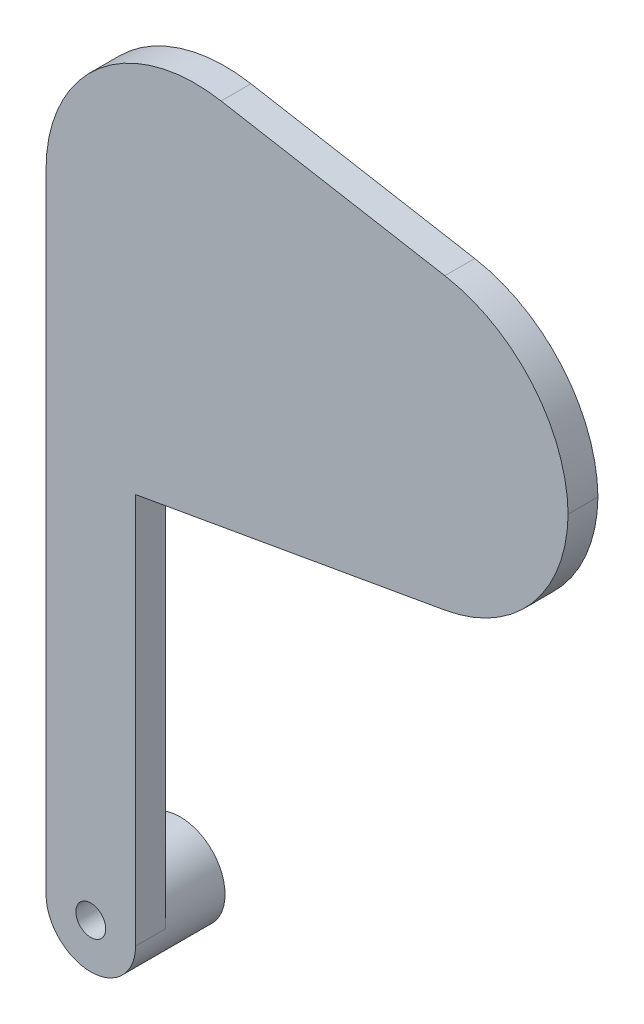
ISO-10303-21;
HEADER;
FILE_DESCRIPTION(('STEP AP214'),'2;1');
FILE_NAME('part.step','',(''),(''),'','','');
FILE_SCHEMA(('AUTOMOTIVE_DESIGN { 1 0 10303 214 1 1 1 1 }'));
ENDSEC;
DATA;
#1=APPLICATION_CONTEXT('core data for automotive mechanical design processes');
#2=APPLICATION_PROTOCOL_DEFINITION('international standard','automotive_design',2000,#1);
#3=PRODUCT_CONTEXT('',#1,'mechanical');
#4=PRODUCT('Part','Part','',(#3));
#5=PRODUCT_RELATED_PRODUCT_CATEGORY('part','',(#4));
#6=PRODUCT_DEFINITION_FORMATION('','',#4);
#7=PRODUCT_DEFINITION_CONTEXT('part definition',#1,'design');
#8=PRODUCT_DEFINITION('design','',#6,#7);
#9=PRODUCT_DEFINITION_SHAPE('','',#8);
#10=(LENGTH_UNIT() NAMED_UNIT(*) SI_UNIT(.MILLI.,.METRE.));
#11=(NAMED_UNIT(*) PLANE_ANGLE_UNIT() SI_UNIT($,.RADIAN.));
#12=(NAMED_UNIT(*) SI_UNIT($,.STERADIAN.) SOLID_ANGLE_UNIT());
#13=UNCERTAINTY_MEASURE_WITH_UNIT(LENGTH_MEASURE(1.E-05),#10,'distance_accuracy_value','');
#14=(GEOMETRIC_REPRESENTATION_CONTEXT(3) GLOBAL_UNCERTAINTY_ASSIGNED_CONTEXT((#13)) GLOBAL_UNIT_ASSIGNED_CONTEXT((#10,
#11,#12)) REPRESENTATION_CONTEXT('',''));
#15=CARTESIAN_POINT('',(0.,0.,0.));
#16=DIRECTION('',(0.,0.,1.));
#17=DIRECTION('',(1.,0.,0.));
#18=AXIS2_PLACEMENT_3D('',#15,#16,#17);
#19=CARTESIAN_POINT('',(25.,39.4375593634308,2.));
#20=DIRECTION('',(0.,0.,-1.));
#21=DIRECTION('',(-1.,0.,0.));
#22=AXIS2_PLACEMENT_3D('',#19,#20,#21);
#23=CYLINDRICAL_SURFACE('',#22,10.);
#24=CARTESIAN_POINT('',(25.,39.4375593634308,0.));
#25=DIRECTION('',(0.,0.,1.));
#26=DIRECTION('',(1.,0.,0.));
#27=AXIS2_PLACEMENT_3D('',#24,#25,#26);
#28=CIRCLE('',#27,10.);
#29=CARTESIAN_POINT('',(26.7364817766693,49.2856368935529,0.));
#30=VERTEX_POINT('',#29);
#31=CARTESIAN_POINT('',(34.999006976508,39.5784830439962,0.));
#32=VERTEX_POINT('',#31);
#33=EDGE_CURVE('E140',#30,#32,#28,.F.);
#34=ORIENTED_EDGE('',*,*,#33,.F.);
#35=DIRECTION('',(0.,0.,-1.));
#36=VECTOR('',#35,1.);
#37=CARTESIAN_POINT('',(26.7364817766693,49.2856368935529,2.));
#38=LINE('',#37,#36);
#39=CARTESIAN_POINT('',(26.7364817766693,49.2856368935529,2.));
#40=VERTEX_POINT('',#39);
#41=EDGE_CURVE('E50',#40,#30,#38,.T.);
#42=ORIENTED_EDGE('',*,*,#41,.F.);
#43=CARTESIAN_POINT('',(25.,39.4375593634308,2.));
#44=DIRECTION('',(0.,0.,1.));
#45=DIRECTION('',(1.,0.,0.));
#46=AXIS2_PLACEMENT_3D('',#43,#44,#45);
#47=CIRCLE('',#46,10.);
#48=CARTESIAN_POINT('',(34.999006976508,39.5784830439962,2.));
#49=VERTEX_POINT('',#48);
#50=EDGE_CURVE('E165',#40,#49,#47,.F.);
#51=ORIENTED_EDGE('',*,*,#50,.T.);
#52=DIRECTION('',(0.,0.,-1.));
#53=VECTOR('',#52,1.);
#54=CARTESIAN_POINT('',(34.999006976508,39.5784830439962,2.));
#55=LINE('',#54,#53);
#56=EDGE_CURVE('E58',#49,#32,#55,.T.);
#57=ORIENTED_EDGE('',*,*,#56,.T.);
#58=EDGE_LOOP('',(#34,#42,#51,#57));
#59=FACE_BOUND('',#58,.T.);
#60=ADVANCED_FACE('F41',(#59),#23,.T.);
#61=CARTESIAN_POINT('',(9.23454386979323,52.3717007612195,2.));
#62=DIRECTION('',(0.173648177666934,0.984807753012207,0.));
#63=DIRECTION('',(-0.984807753012208,0.173648177666934,0.));
#64=AXIS2_PLACEMENT_3D('',#61,#62,#63);
#65=PLANE('',#64);
#66=DIRECTION('',(0.984807753012208,-0.173648177666934,0.));
#67=VECTOR('',#66,1.);
#68=CARTESIAN_POINT('',(9.23454386979323,52.3717007612195,0.));
#69=LINE('',#68,#67);
#70=CARTESIAN_POINT('',(11.7364817766694,51.9305416041799,0.));
#71=VERTEX_POINT('',#70);
#72=EDGE_CURVE('E143',#71,#30,#69,.T.);
#73=ORIENTED_EDGE('',*,*,#72,.F.);
#74=DIRECTION('',(0.,0.,-1.));
#75=VECTOR('',#74,1.);
#76=CARTESIAN_POINT('',(11.7364817766694,51.9305416041799,2.));
#77=LINE('',#76,#75);
#78=CARTESIAN_POINT('',(11.7364817766694,51.9305416041799,2.));
#79=VERTEX_POINT('',#78);
#80=EDGE_CURVE('E179',#79,#71,#77,.T.);
#81=ORIENTED_EDGE('',*,*,#80,.F.);
#82=DIRECTION('',(0.984807753012208,-0.173648177666934,0.));
#83=VECTOR('',#82,1.);
#84=CARTESIAN_POINT('',(9.23454386979323,52.3717007612195,2.));
#85=LINE('',#84,#83);
#86=EDGE_CURVE('E187',#79,#40,#85,.T.);
#87=ORIENTED_EDGE('',*,*,#86,.T.);
#88=ORIENTED_EDGE('',*,*,#41,.T.);
#89=EDGE_LOOP('',(#73,#81,#87,#88));
#90=FACE_BOUND('',#89,.T.);
#91=ADVANCED_FACE('F185',(#90),#65,.T.);
#92=CARTESIAN_POINT('',(10.,42.0824640740579,2.));
#93=DIRECTION('',(0.,0.,-1.));
#94=DIRECTION('',(-1.,0.,0.));
#95=AXIS2_PLACEMENT_3D('',#92,#93,#94);
#96=CYLINDRICAL_SURFACE('',#95,10.);
#97=CARTESIAN_POINT('',(10.,42.0824640740579,0.));
#98=DIRECTION('',(0.,0.,1.));
#99=DIRECTION('',(1.,0.,0.));
#100=AXIS2_PLACEMENT_3D('',#97,#98,#99);
#101=CIRCLE('',#100,10.);
#102=CARTESIAN_POINT('',(0.,42.0824640740578,0.));
#103=VERTEX_POINT('',#102);
#104=EDGE_CURVE('E148',#103,#71,#101,.F.);
#105=ORIENTED_EDGE('',*,*,#104,.F.);
#106=DIRECTION('',(0.,0.,-1.));
#107=VECTOR('',#106,1.);
#108=CARTESIAN_POINT('',(0.,42.0824640740578,2.));
#109=LINE('',#108,#107);
#110=CARTESIAN_POINT('',(0.,42.0824640740578,2.));
#111=VERTEX_POINT('',#110);
#112=EDGE_CURVE('E176',#111,#103,#109,.T.);
#113=ORIENTED_EDGE('',*,*,#112,.F.);
#114=CARTESIAN_POINT('',(10.,42.0824640740579,2.));
#115=DIRECTION('',(0.,0.,1.));
#116=DIRECTION('',(1.,0.,0.));
#117=AXIS2_PLACEMENT_3D('',#114,#115,#116);
#118=CIRCLE('',#117,10.);
#119=EDGE_CURVE('E196',#111,#79,#118,.F.);
#120=ORIENTED_EDGE('',*,*,#119,.T.);
#121=ORIENTED_EDGE('',*,*,#80,.T.);
#122=EDGE_LOOP('',(#105,#113,#120,#121));
#123=FACE_BOUND('',#122,.T.);
#124=ADVANCED_FACE('F193',(#123),#96,.T.);
#125=CARTESIAN_POINT('',(0.,0.,2.));
#126=DIRECTION('',(-1.,0.,0.));
#127=DIRECTION('',(0.,0.,1.));
#128=AXIS2_PLACEMENT_3D('',#125,#126,#127);
#129=PLANE('',#128);
#130=DIRECTION('',(0.,1.,0.));
#131=VECTOR('',#130,1.);
#132=CARTESIAN_POINT('',(0.,0.,0.));
#133=LINE('',#132,#131);
#134=CARTESIAN_POINT('',(0.,0.,0.));
#135=VERTEX_POINT('',#134);
#136=EDGE_CURVE('E152',#135,#103,#133,.T.);
#137=ORIENTED_EDGE('',*,*,#136,.F.);
#138=DIRECTION('',(0.,0.,-1.));
#139=VECTOR('',#138,1.);
#140=CARTESIAN_POINT('',(0.,0.,2.));
#141=LINE('',#140,#139);
#142=CARTESIAN_POINT('',(0.,0.,2.));
#143=VERTEX_POINT('',#142);
#144=EDGE_CURVE('E172',#143,#135,#141,.T.);
#145=ORIENTED_EDGE('',*,*,#144,.F.);
#146=DIRECTION('',(0.,1.,0.));
#147=VECTOR('',#146,1.);
#148=CARTESIAN_POINT('',(0.,0.,2.));
#149=LINE('',#148,#147);
#150=EDGE_CURVE('E202',#143,#111,#149,.T.);
#151=ORIENTED_EDGE('',*,*,#150,.T.);
#152=ORIENTED_EDGE('',*,*,#112,.T.);
#153=EDGE_LOOP('',(#137,#145,#151,#152));
#154=FACE_BOUND('',#153,.T.);
#155=ADVANCED_FACE('F210',(#154),#129,.T.);
#156=CARTESIAN_POINT('',(3.,0.,2.));
#157=DIRECTION('',(0.,0.,-1.));
#158=DIRECTION('',(-1.,0.,0.));
#159=AXIS2_PLACEMENT_3D('',#156,#157,#158);
#160=CYLINDRICAL_SURFACE('',#159,3.);
#161=ORIENTED_EDGE('',*,*,#144,.T.);
#162=CARTESIAN_POINT('',(3.,0.,0.));
#163=DIRECTION('',(0.,0.,1.));
#164=DIRECTION('',(1.,0.,0.));
#165=AXIS2_PLACEMENT_3D('',#162,#163,#164);
#166=CIRCLE('',#165,3.);
#167=CARTESIAN_POINT('',(6.,0.,0.));
#168=VERTEX_POINT('',#167);
#169=EDGE_CURVE('E11',#168,#135,#166,.T.);
#170=ORIENTED_EDGE('',*,*,#169,.F.);
#171=DIRECTION('',(0.,0.,-1.));
#172=VECTOR('',#171,1.);
#173=CARTESIAN_POINT('',(6.,0.,2.));
#174=LINE('',#173,#172);
#175=CARTESIAN_POINT('',(6.,0.,2.));
#176=VERTEX_POINT('',#175);
#177=EDGE_CURVE('E119',#176,#168,#174,.T.);
#178=ORIENTED_EDGE('',*,*,#177,.F.);
#179=CARTESIAN_POINT('',(3.,0.,2.));
#180=DIRECTION('',(0.,0.,1.));
#181=DIRECTION('',(1.,0.,0.));
#182=AXIS2_PLACEMENT_3D('',#179,#180,#181);
#183=CIRCLE('',#182,3.);
#184=EDGE_CURVE('E128',#143,#176,#183,.T.);
#185=ORIENTED_EDGE('',*,*,#184,.F.);
#186=EDGE_LOOP('',(#161,#170,#178,#185));
#187=FACE_BOUND('',#186,.T.);
#188=CARTESIAN_POINT('',(3.,0.,-4.));
#189=DIRECTION('',(0.,0.,1.));
#190=DIRECTION('',(1.,0.,0.));
#191=AXIS2_PLACEMENT_3D('',#188,#189,#190);
#192=CIRCLE('',#191,3.);
#193=CARTESIAN_POINT('',(6.,0.,-4.));
#194=VERTEX_POINT('',#193);
#195=EDGE_CURVE('E144',#194,#194,#192,.T.);
#196=ORIENTED_EDGE('',*,*,#195,.T.);
#197=EDGE_LOOP('',(#196));
#198=FACE_BOUND('',#197,.T.);
#199=ADVANCED_FACE('F212',(#187,#198),#160,.T.);
#200=CARTESIAN_POINT('',(6.,0.,2.));
#201=DIRECTION('',(1.,0.,0.));
#202=DIRECTION('',(0.,1.,0.));
#203=AXIS2_PLACEMENT_3D('',#200,#201,#202);
#204=PLANE('',#203);
#205=DIRECTION('',(0.,-1.,0.));
#206=VECTOR('',#205,1.);
#207=CARTESIAN_POINT('',(6.,0.,0.));
#208=LINE('',#207,#206);
#209=CARTESIAN_POINT('',(6.,26.214927972243,0.));
#210=VERTEX_POINT('',#209);
#211=EDGE_CURVE('E114',#210,#168,#208,.T.);
#212=ORIENTED_EDGE('',*,*,#211,.F.);
#213=DIRECTION('',(0.,0.,-1.));
#214=VECTOR('',#213,1.);
#215=CARTESIAN_POINT('',(6.,26.214927972243,2.));
#216=LINE('',#215,#214);
#217=CARTESIAN_POINT('',(6.,26.214927972243,2.));
#218=VERTEX_POINT('',#217);
#219=EDGE_CURVE('E108',#218,#210,#216,.T.);
#220=ORIENTED_EDGE('',*,*,#219,.F.);
#221=DIRECTION('',(0.,-1.,0.));
#222=VECTOR('',#221,1.);
#223=CARTESIAN_POINT('',(6.,0.,2.));
#224=LINE('',#223,#222);
#225=EDGE_CURVE('E112',#218,#176,#224,.T.);
#226=ORIENTED_EDGE('',*,*,#225,.T.);
#227=ORIENTED_EDGE('',*,*,#177,.T.);
#228=EDGE_LOOP('',(#212,#220,#226,#227));
#229=FACE_BOUND('',#228,.T.);
#230=ADVANCED_FACE('F110',(#229),#204,.T.);
#231=CARTESIAN_POINT('',(-4.3020945735268,24.3983907411201,2.));
#232=DIRECTION('',(0.17364817766692,-0.98480775301221,0.));
#233=DIRECTION('',(0.98480775301221,0.17364817766692,0.));
#234=AXIS2_PLACEMENT_3D('',#231,#232,#233);
#235=PLANE('',#234);
#236=DIRECTION('',(-0.98480775301221,-0.17364817766692,0.));
#237=VECTOR('',#236,1.);
#238=CARTESIAN_POINT('',(-4.3020945735268,24.3983907411201,0.));
#239=LINE('',#238,#237);
#240=CARTESIAN_POINT('',(26.7364817766692,29.8713291944389,0.));
#241=VERTEX_POINT('',#240);
#242=EDGE_CURVE('E158',#241,#210,#239,.T.);
#243=ORIENTED_EDGE('',*,*,#242,.F.);
#244=DIRECTION('',(0.,0.,-1.));
#245=VECTOR('',#244,1.);
#246=CARTESIAN_POINT('',(26.7364817766692,29.8713291944389,2.));
#247=LINE('',#246,#245);
#248=CARTESIAN_POINT('',(26.7364817766692,29.8713291944389,2.));
#249=VERTEX_POINT('',#248);
#250=EDGE_CURVE('E82',#249,#241,#247,.T.);
#251=ORIENTED_EDGE('',*,*,#250,.F.);
#252=DIRECTION('',(-0.98480775301221,-0.17364817766692,0.));
#253=VECTOR('',#252,1.);
#254=CARTESIAN_POINT('',(-4.3020945735268,24.3983907411201,2.));
#255=LINE('',#254,#253);
#256=EDGE_CURVE('E126',#249,#218,#255,.T.);
#257=ORIENTED_EDGE('',*,*,#256,.T.);
#258=ORIENTED_EDGE('',*,*,#219,.T.);
#259=EDGE_LOOP('',(#243,#251,#257,#258));
#260=FACE_BOUND('',#259,.T.);
#261=ADVANCED_FACE('F132',(#260),#235,.T.);
#262=CARTESIAN_POINT('',(25.,39.719406724561,2.));
#263=DIRECTION('',(0.,0.,-1.));
#264=DIRECTION('',(-1.,0.,0.));
#265=AXIS2_PLACEMENT_3D('',#262,#263,#264);
#266=CYLINDRICAL_SURFACE('',#265,10.);
#267=CARTESIAN_POINT('',(25.,39.719406724561,0.));
#268=DIRECTION('',(0.,0.,1.));
#269=DIRECTION('',(1.,0.,0.));
#270=AXIS2_PLACEMENT_3D('',#267,#268,#269);
#271=CIRCLE('',#270,10.);
#272=EDGE_CURVE('E161',#32,#241,#271,.F.);
#273=ORIENTED_EDGE('',*,*,#272,.F.);
#274=ORIENTED_EDGE('',*,*,#56,.F.);
#275=CARTESIAN_POINT('',(25.,39.719406724561,2.));
#276=DIRECTION('',(0.,0.,1.));
#277=DIRECTION('',(1.,0.,0.));
#278=AXIS2_PLACEMENT_3D('',#275,#276,#277);
#279=CIRCLE('',#278,10.);
#280=EDGE_CURVE('E134',#49,#249,#279,.F.);
#281=ORIENTED_EDGE('',*,*,#280,.T.);
#282=ORIENTED_EDGE('',*,*,#250,.T.);
#283=EDGE_LOOP('',(#273,#274,#281,#282));
#284=FACE_BOUND('',#283,.T.);
#285=ADVANCED_FACE('F214',(#284),#266,.T.);
#286=CARTESIAN_POINT('',(0.,0.,2.));
#287=DIRECTION('',(0.,0.,1.));
#288=DIRECTION('',(1.,0.,0.));
#289=AXIS2_PLACEMENT_3D('',#286,#287,#288);
#290=PLANE('',#289);
#291=CARTESIAN_POINT('',(3.,0.,2.));
#292=DIRECTION('',(0.,0.,-1.));
#293=DIRECTION('',(-1.,0.,0.));
#294=AXIS2_PLACEMENT_3D('',#291,#292,#293);
#295=CIRCLE('',#294,1.);
#296=CARTESIAN_POINT('',(2.,0.,2.));
#297=VERTEX_POINT('',#296);
#298=EDGE_CURVE('E327',#297,#297,#295,.T.);
#299=ORIENTED_EDGE('',*,*,#298,.T.);
#300=EDGE_LOOP('',(#299));
#301=FACE_BOUND('',#300,.T.);
#302=ORIENTED_EDGE('',*,*,#150,.F.);
#303=ORIENTED_EDGE('',*,*,#184,.T.);
#304=ORIENTED_EDGE('',*,*,#225,.F.);
#305=ORIENTED_EDGE('',*,*,#256,.F.);
#306=ORIENTED_EDGE('',*,*,#280,.F.);
#307=ORIENTED_EDGE('',*,*,#50,.F.);
#308=ORIENTED_EDGE('',*,*,#86,.F.);
#309=ORIENTED_EDGE('',*,*,#119,.F.);
#310=EDGE_LOOP('',(#302,#303,#304,#305,#306,#307,#308,#309));
#311=FACE_BOUND('',#310,.T.);
#312=ADVANCED_FACE('F124',(#301,#311),#290,.T.);
#313=CARTESIAN_POINT('',(0.,0.,0.));
#314=DIRECTION('',(0.,0.,1.));
#315=DIRECTION('',(1.,0.,0.));
#316=AXIS2_PLACEMENT_3D('',#313,#314,#315);
#317=PLANE('',#316);
#318=ORIENTED_EDGE('',*,*,#211,.T.);
#319=ORIENTED_EDGE('',*,*,#169,.T.);
#320=ORIENTED_EDGE('',*,*,#136,.T.);
#321=ORIENTED_EDGE('',*,*,#104,.T.);
#322=ORIENTED_EDGE('',*,*,#72,.T.);
#323=ORIENTED_EDGE('',*,*,#33,.T.);
#324=ORIENTED_EDGE('',*,*,#272,.T.);
#325=ORIENTED_EDGE('',*,*,#242,.T.);
#326=EDGE_LOOP('',(#318,#319,#320,#321,#322,#323,#324,#325));
#327=FACE_BOUND('',#326,.T.);
#328=ADVANCED_FACE('F189',(#327),#317,.F.);
#329=CARTESIAN_POINT('',(3.,0.,-4.));
#330=DIRECTION('',(0.,0.,1.));
#331=DIRECTION('',(1.,0.,0.));
#332=AXIS2_PLACEMENT_3D('',#329,#330,#331);
#333=PLANE('',#332);
#334=CARTESIAN_POINT('',(3.,0.,-4.));
#335=DIRECTION('',(0.,0.,-1.));
#336=DIRECTION('',(-1.,0.,0.));
#337=AXIS2_PLACEMENT_3D('',#334,#335,#336);
#338=CIRCLE('',#337,2.5);
#339=CARTESIAN_POINT('',(0.500000000000001,0.,-4.));
#340=VERTEX_POINT('',#339);
#341=EDGE_CURVE('E334',#340,#340,#338,.T.);
#342=ORIENTED_EDGE('',*,*,#341,.F.);
#343=EDGE_LOOP('',(#342));
#344=FACE_BOUND('',#343,.T.);
#345=ORIENTED_EDGE('',*,*,#195,.F.);
#346=EDGE_LOOP('',(#345));
#347=FACE_BOUND('',#346,.T.);
#348=ADVANCED_FACE('F277',(#344,#347),#333,.F.);
#349=CARTESIAN_POINT('',(3.,0.,0.));
#350=DIRECTION('',(0.,0.,-1.));
#351=DIRECTION('',(-1.,0.,0.));
#352=AXIS2_PLACEMENT_3D('',#349,#350,#351);
#353=CYLINDRICAL_SURFACE('',#352,2.5);
#354=CARTESIAN_POINT('',(3.,0.,0.));
#355=DIRECTION('',(0.,0.,-1.));
#356=DIRECTION('',(-1.,0.,0.));
#357=AXIS2_PLACEMENT_3D('',#354,#355,#356);
#358=CIRCLE('',#357,2.5);
#359=CARTESIAN_POINT('',(0.500000000000001,0.,0.));
#360=VERTEX_POINT('',#359);
#361=EDGE_CURVE('E337',#360,#360,#358,.T.);
#362=ORIENTED_EDGE('',*,*,#361,.F.);
#363=EDGE_LOOP('',(#362));
#364=FACE_BOUND('',#363,.T.);
#365=ORIENTED_EDGE('',*,*,#341,.T.);
#366=EDGE_LOOP('',(#365));
#367=FACE_BOUND('',#366,.T.);
#368=ADVANCED_FACE('F283',(#364,#367),#353,.F.);
#369=CARTESIAN_POINT('',(3.,0.,0.));
#370=DIRECTION('',(0.,0.,-1.));
#371=DIRECTION('',(-1.,0.,0.));
#372=AXIS2_PLACEMENT_3D('',#369,#370,#371);
#373=PLANE('',#372);
#374=CARTESIAN_POINT('',(3.,0.,0.));
#375=DIRECTION('',(0.,0.,-1.));
#376=DIRECTION('',(-1.,0.,0.));
#377=AXIS2_PLACEMENT_3D('',#374,#375,#376);
#378=CIRCLE('',#377,1.);
#379=CARTESIAN_POINT('',(2.,0.,0.));
#380=VERTEX_POINT('',#379);
#381=EDGE_CURVE('E330',#380,#380,#378,.T.);
#382=ORIENTED_EDGE('',*,*,#381,.F.);
#383=EDGE_LOOP('',(#382));
#384=FACE_BOUND('',#383,.T.);
#385=ORIENTED_EDGE('',*,*,#361,.T.);
#386=EDGE_LOOP('',(#385));
#387=FACE_BOUND('',#386,.T.);
#388=ADVANCED_FACE('F292',(#384,#387),#373,.T.);
#389=CARTESIAN_POINT('',(3.,0.,2.));
#390=DIRECTION('',(0.,0.,-1.));
#391=DIRECTION('',(-1.,0.,0.));
#392=AXIS2_PLACEMENT_3D('',#389,#390,#391);
#393=CYLINDRICAL_SURFACE('',#392,1.);
#394=ORIENTED_EDGE('',*,*,#298,.F.);
#395=EDGE_LOOP('',(#394));
#396=FACE_BOUND('',#395,.T.);
#397=ORIENTED_EDGE('',*,*,#381,.T.);
#398=EDGE_LOOP('',(#397));
#399=FACE_BOUND('',#398,.T.);
#400=ADVANCED_FACE('F302',(#396,#399),#393,.F.);
#401=CLOSED_SHELL('',(#60,#91,#124,#155,#199,#230,#261,#285,#312,#328,#348,#368,#388,#400));
#402=MANIFOLD_SOLID_BREP('B2',#401);
#403=ADVANCED_BREP_SHAPE_REPRESENTATION('',(#18,#402),#14);
#404=SHAPE_DEFINITION_REPRESENTATION(#9,#403);
ENDSEC;
END-ISO-10303-21;
